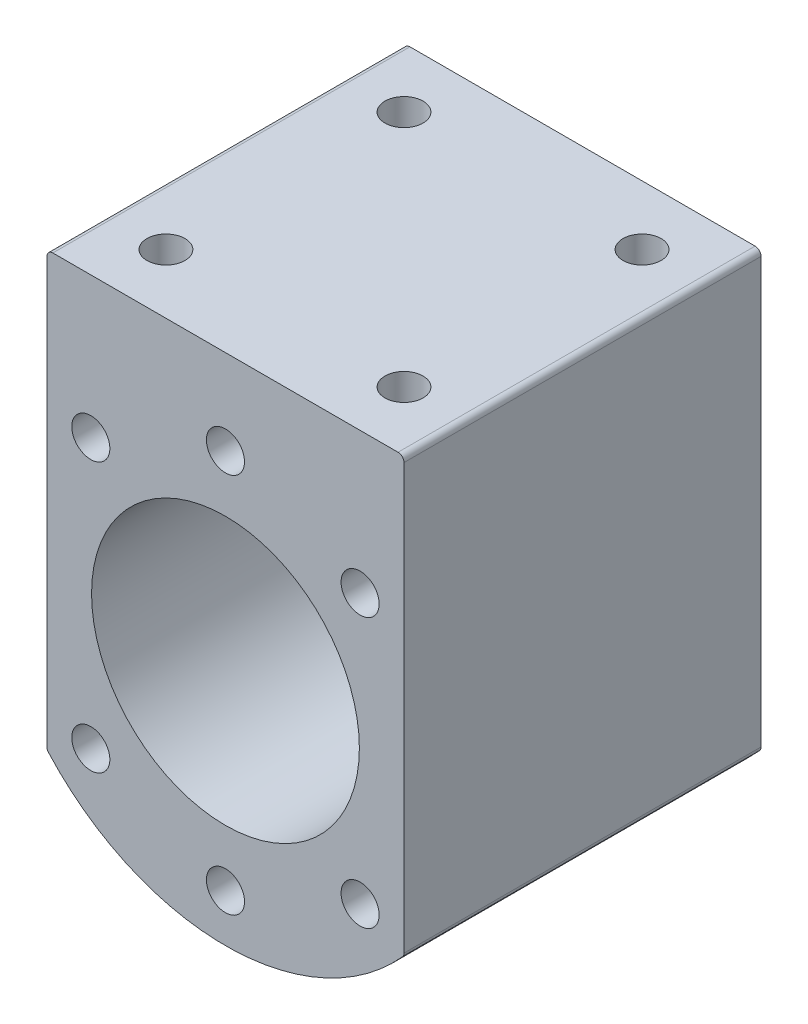
ISO-10303-21;
HEADER;
FILE_DESCRIPTION(('STEP AP214'),'2;1');
FILE_NAME('part.step','',(''),(''),'','','');
FILE_SCHEMA(('AUTOMOTIVE_DESIGN { 1 0 10303 214 1 1 1 1 }'));
ENDSEC;
DATA;
#1=APPLICATION_CONTEXT('core data for automotive mechanical design processes');
#2=APPLICATION_PROTOCOL_DEFINITION('international standard','automotive_design',2000,#1);
#3=PRODUCT_CONTEXT('',#1,'mechanical');
#4=PRODUCT('Part','Part','',(#3));
#5=PRODUCT_RELATED_PRODUCT_CATEGORY('part','',(#4));
#6=PRODUCT_DEFINITION_FORMATION('','',#4);
#7=PRODUCT_DEFINITION_CONTEXT('part definition',#1,'design');
#8=PRODUCT_DEFINITION('design','',#6,#7);
#9=PRODUCT_DEFINITION_SHAPE('','',#8);
#10=(LENGTH_UNIT() NAMED_UNIT(*) SI_UNIT(.MILLI.,.METRE.));
#11=(NAMED_UNIT(*) PLANE_ANGLE_UNIT() SI_UNIT($,.RADIAN.));
#12=(NAMED_UNIT(*) SI_UNIT($,.STERADIAN.) SOLID_ANGLE_UNIT());
#13=UNCERTAINTY_MEASURE_WITH_UNIT(LENGTH_MEASURE(1.E-05),#10,'distance_accuracy_value','');
#14=(GEOMETRIC_REPRESENTATION_CONTEXT(3) GLOBAL_UNCERTAINTY_ASSIGNED_CONTEXT((#13)) GLOBAL_UNIT_ASSIGNED_CONTEXT((#10,
#11,#12)) REPRESENTATION_CONTEXT('',''));
#15=CARTESIAN_POINT('',(0.,0.,0.));
#16=DIRECTION('',(0.,0.,1.));
#17=DIRECTION('',(1.,0.,0.));
#18=AXIS2_PLACEMENT_3D('',#15,#16,#17);
#19=CARTESIAN_POINT('',(15.,23.1512434446771,30.));
#20=DIRECTION('',(0.,-1.,0.));
#21=DIRECTION('',(0.,0.,-1.));
#22=AXIS2_PLACEMENT_3D('',#19,#20,#21);
#23=PLANE('',#22);
#24=CARTESIAN_POINT('',(10.,23.1512434446771,25.));
#25=DIRECTION('',(0.,1.,0.));
#26=DIRECTION('',(0.,0.,-1.));
#27=AXIS2_PLACEMENT_3D('',#24,#25,#26);
#28=CIRCLE('',#27,1.6);
#29=CARTESIAN_POINT('',(10.,23.1512434446771,23.4));
#30=VERTEX_POINT('',#29);
#31=EDGE_CURVE('E229',#30,#30,#28,.T.);
#32=ORIENTED_EDGE('',*,*,#31,.F.);
#33=EDGE_LOOP('',(#32));
#34=FACE_BOUND('',#33,.T.);
#35=CARTESIAN_POINT('',(9.99999999999999,23.1512434446771,5.));
#36=DIRECTION('',(0.,1.,0.));
#37=DIRECTION('',(0.,0.,1.));
#38=AXIS2_PLACEMENT_3D('',#35,#36,#37);
#39=CIRCLE('',#38,1.6);
#40=CARTESIAN_POINT('',(9.99999999999999,23.1512434446771,6.6));
#41=VERTEX_POINT('',#40);
#42=EDGE_CURVE('E223',#41,#41,#39,.T.);
#43=ORIENTED_EDGE('',*,*,#42,.F.);
#44=EDGE_LOOP('',(#43));
#45=FACE_BOUND('',#44,.T.);
#46=CARTESIAN_POINT('',(-10.,23.1512434446771,5.));
#47=DIRECTION('',(0.,1.,0.));
#48=DIRECTION('',(0.,0.,-1.));
#49=AXIS2_PLACEMENT_3D('',#46,#47,#48);
#50=CIRCLE('',#49,1.6);
#51=CARTESIAN_POINT('',(-10.,23.1512434446771,3.4));
#52=VERTEX_POINT('',#51);
#53=EDGE_CURVE('E217',#52,#52,#50,.T.);
#54=ORIENTED_EDGE('',*,*,#53,.F.);
#55=EDGE_LOOP('',(#54));
#56=FACE_BOUND('',#55,.T.);
#57=CARTESIAN_POINT('',(-10.,23.1512434446771,25.));
#58=DIRECTION('',(0.,1.,0.));
#59=DIRECTION('',(0.,0.,1.));
#60=AXIS2_PLACEMENT_3D('',#57,#58,#59);
#61=CIRCLE('',#60,1.6);
#62=CARTESIAN_POINT('',(-10.,23.1512434446771,26.6));
#63=VERTEX_POINT('',#62);
#64=EDGE_CURVE('E211',#63,#63,#61,.T.);
#65=ORIENTED_EDGE('',*,*,#64,.F.);
#66=EDGE_LOOP('',(#65));
#67=FACE_BOUND('',#66,.T.);
#68=DIRECTION('',(-1.,0.,0.));
#69=VECTOR('',#68,1.);
#70=CARTESIAN_POINT('',(15.,23.1512434446771,0.));
#71=LINE('',#70,#69);
#72=CARTESIAN_POINT('',(14.5,23.1512434446771,0.));
#73=VERTEX_POINT('',#72);
#74=CARTESIAN_POINT('',(-14.5,23.1512434446771,0.));
#75=VERTEX_POINT('',#74);
#76=EDGE_CURVE('E128',#73,#75,#71,.T.);
#77=ORIENTED_EDGE('',*,*,#76,.T.);
#78=DIRECTION('',(0.,0.,-1.));
#79=VECTOR('',#78,1.);
#80=CARTESIAN_POINT('',(-14.5,23.1512434446771,30.));
#81=LINE('',#80,#79);
#82=CARTESIAN_POINT('',(-14.5,23.1512434446771,30.));
#83=VERTEX_POINT('',#82);
#84=EDGE_CURVE('E11',#75,#83,#81,.F.);
#85=ORIENTED_EDGE('',*,*,#84,.T.);
#86=DIRECTION('',(-1.,0.,0.));
#87=VECTOR('',#86,1.);
#88=CARTESIAN_POINT('',(15.,23.1512434446771,30.));
#89=LINE('',#88,#87);
#90=CARTESIAN_POINT('',(14.5,23.1512434446771,30.));
#91=VERTEX_POINT('',#90);
#92=EDGE_CURVE('E126',#91,#83,#89,.T.);
#93=ORIENTED_EDGE('',*,*,#92,.F.);
#94=DIRECTION('',(0.,0.,-1.));
#95=VECTOR('',#94,1.);
#96=CARTESIAN_POINT('',(14.5,23.1512434446771,30.));
#97=LINE('',#96,#95);
#98=EDGE_CURVE('E40',#91,#73,#97,.T.);
#99=ORIENTED_EDGE('',*,*,#98,.T.);
#100=EDGE_LOOP('',(#77,#85,#93,#99));
#101=FACE_BOUND('',#100,.T.);
#102=ADVANCED_FACE('F32',(#34,#45,#56,#67,#101),#23,.F.);
#103=CARTESIAN_POINT('',(-15.,23.1512434446771,30.));
#104=DIRECTION('',(1.,0.,0.));
#105=DIRECTION('',(0.,1.,0.));
#106=AXIS2_PLACEMENT_3D('',#103,#104,#105);
#107=PLANE('',#106);
#108=DIRECTION('',(0.,-1.,0.));
#109=VECTOR('',#108,1.);
#110=CARTESIAN_POINT('',(-15.,23.1512434446771,0.));
#111=LINE('',#110,#109);
#112=CARTESIAN_POINT('',(-15.,22.6512434446771,0.));
#113=VERTEX_POINT('',#112);
#114=CARTESIAN_POINT('',(-15.,-13.0384048104053,0.));
#115=VERTEX_POINT('',#114);
#116=EDGE_CURVE('E124',#113,#115,#111,.T.);
#117=ORIENTED_EDGE('',*,*,#116,.T.);
#118=DIRECTION('',(0.,0.,-1.));
#119=VECTOR('',#118,1.);
#120=CARTESIAN_POINT('',(-15.,-13.0384048104053,30.));
#121=LINE('',#120,#119);
#122=CARTESIAN_POINT('',(-15.,-13.0384048104053,30.));
#123=VERTEX_POINT('',#122);
#124=EDGE_CURVE('E103',#115,#123,#121,.F.);
#125=ORIENTED_EDGE('',*,*,#124,.T.);
#126=DIRECTION('',(0.,-1.,0.));
#127=VECTOR('',#126,1.);
#128=CARTESIAN_POINT('',(-15.,23.1512434446771,30.));
#129=LINE('',#128,#127);
#130=CARTESIAN_POINT('',(-15.,22.6512434446771,30.));
#131=VERTEX_POINT('',#130);
#132=EDGE_CURVE('E188',#131,#123,#129,.T.);
#133=ORIENTED_EDGE('',*,*,#132,.F.);
#134=DIRECTION('',(0.,0.,-1.));
#135=VECTOR('',#134,1.);
#136=CARTESIAN_POINT('',(-15.,22.6512434446771,30.));
#137=LINE('',#136,#135);
#138=EDGE_CURVE('E108',#131,#113,#137,.T.);
#139=ORIENTED_EDGE('',*,*,#138,.T.);
#140=EDGE_LOOP('',(#117,#125,#133,#139));
#141=FACE_BOUND('',#140,.T.);
#142=ADVANCED_FACE('F246',(#141),#107,.F.);
#143=CARTESIAN_POINT('',(0.,0.,30.));
#144=DIRECTION('',(0.,0.,-1.));
#145=DIRECTION('',(-1.,0.,0.));
#146=AXIS2_PLACEMENT_3D('',#143,#144,#145);
#147=CYLINDRICAL_SURFACE('',#146,20.);
#148=CARTESIAN_POINT('',(0.,0.,30.));
#149=DIRECTION('',(0.,0.,1.));
#150=DIRECTION('',(1.,0.,0.));
#151=AXIS2_PLACEMENT_3D('',#148,#149,#150);
#152=CIRCLE('',#151,20.);
#153=CARTESIAN_POINT('',(-14.8717948717949,-13.372722882467,30.));
#154=VERTEX_POINT('',#153);
#155=CARTESIAN_POINT('',(14.8717948717949,-13.372722882467,30.));
#156=VERTEX_POINT('',#155);
#157=EDGE_CURVE('E117',#154,#156,#152,.T.);
#158=ORIENTED_EDGE('',*,*,#157,.F.);
#159=DIRECTION('',(0.,0.,-1.));
#160=VECTOR('',#159,1.);
#161=CARTESIAN_POINT('',(-14.8717948717949,-13.372722882467,30.));
#162=LINE('',#161,#160);
#163=CARTESIAN_POINT('',(-14.8717948717949,-13.372722882467,0.));
#164=VERTEX_POINT('',#163);
#165=EDGE_CURVE('E102',#154,#164,#162,.T.);
#166=ORIENTED_EDGE('',*,*,#165,.T.);
#167=CARTESIAN_POINT('',(0.,0.,0.));
#168=DIRECTION('',(0.,0.,1.));
#169=DIRECTION('',(1.,0.,0.));
#170=AXIS2_PLACEMENT_3D('',#167,#168,#169);
#171=CIRCLE('',#170,20.);
#172=CARTESIAN_POINT('',(14.8717948717949,-13.372722882467,0.));
#173=VERTEX_POINT('',#172);
#174=EDGE_CURVE('E115',#164,#173,#171,.T.);
#175=ORIENTED_EDGE('',*,*,#174,.T.);
#176=DIRECTION('',(0.,0.,-1.));
#177=VECTOR('',#176,1.);
#178=CARTESIAN_POINT('',(14.8717948717949,-13.372722882467,30.));
#179=LINE('',#178,#177);
#180=EDGE_CURVE('E119',#173,#156,#179,.F.);
#181=ORIENTED_EDGE('',*,*,#180,.T.);
#182=EDGE_LOOP('',(#158,#166,#175,#181));
#183=FACE_BOUND('',#182,.T.);
#184=ADVANCED_FACE('F114',(#183),#147,.T.);
#185=CARTESIAN_POINT('',(15.,23.1512434446771,30.));
#186=DIRECTION('',(-1.,0.,0.));
#187=DIRECTION('',(0.,-1.,0.));
#188=AXIS2_PLACEMENT_3D('',#185,#186,#187);
#189=PLANE('',#188);
#190=DIRECTION('',(0.,1.,0.));
#191=VECTOR('',#190,1.);
#192=CARTESIAN_POINT('',(15.,23.1512434446771,30.));
#193=LINE('',#192,#191);
#194=CARTESIAN_POINT('',(15.,-13.0384048104053,30.));
#195=VERTEX_POINT('',#194);
#196=CARTESIAN_POINT('',(15.,22.6512434446771,30.));
#197=VERTEX_POINT('',#196);
#198=EDGE_CURVE('E156',#195,#197,#193,.T.);
#199=ORIENTED_EDGE('',*,*,#198,.F.);
#200=DIRECTION('',(0.,0.,-1.));
#201=VECTOR('',#200,1.);
#202=CARTESIAN_POINT('',(15.,-13.0384048104053,30.));
#203=LINE('',#202,#201);
#204=CARTESIAN_POINT('',(15.,-13.0384048104053,0.));
#205=VERTEX_POINT('',#204);
#206=EDGE_CURVE('E173',#195,#205,#203,.T.);
#207=ORIENTED_EDGE('',*,*,#206,.T.);
#208=DIRECTION('',(0.,1.,0.));
#209=VECTOR('',#208,1.);
#210=CARTESIAN_POINT('',(15.,23.1512434446771,0.));
#211=LINE('',#210,#209);
#212=CARTESIAN_POINT('',(15.,22.6512434446771,0.));
#213=VERTEX_POINT('',#212);
#214=EDGE_CURVE('E123',#205,#213,#211,.T.);
#215=ORIENTED_EDGE('',*,*,#214,.T.);
#216=DIRECTION('',(0.,0.,-1.));
#217=VECTOR('',#216,1.);
#218=CARTESIAN_POINT('',(15.,22.6512434446771,30.));
#219=LINE('',#218,#217);
#220=EDGE_CURVE('E47',#213,#197,#219,.F.);
#221=ORIENTED_EDGE('',*,*,#220,.T.);
#222=EDGE_LOOP('',(#199,#207,#215,#221));
#223=FACE_BOUND('',#222,.T.);
#224=ADVANCED_FACE('F323',(#223),#189,.F.);
#225=CARTESIAN_POINT('',(0.,0.,30.));
#226=DIRECTION('',(0.,0.,1.));
#227=DIRECTION('',(1.,0.,0.));
#228=AXIS2_PLACEMENT_3D('',#225,#226,#227);
#229=PLANE('',#228);
#230=CARTESIAN_POINT('',(0.,0.,30.));
#231=DIRECTION('',(0.,0.,-1.));
#232=DIRECTION('',(-1.,0.,0.));
#233=AXIS2_PLACEMENT_3D('',#230,#231,#232);
#234=CIRCLE('',#233,11.25);
#235=CARTESIAN_POINT('',(-11.25,0.,30.));
#236=VERTEX_POINT('',#235);
#237=EDGE_CURVE('E204',#236,#236,#234,.T.);
#238=ORIENTED_EDGE('',*,*,#237,.T.);
#239=EDGE_LOOP('',(#238));
#240=FACE_BOUND('',#239,.T.);
#241=CARTESIAN_POINT('',(-11.3137084989847,-11.3137084989848,30.));
#242=DIRECTION('',(0.,0.,1.));
#243=DIRECTION('',(1.,0.,0.));
#244=AXIS2_PLACEMENT_3D('',#241,#242,#243);
#245=CIRCLE('',#244,1.6);
#246=CARTESIAN_POINT('',(-9.7137084989847,-11.3137084989848,30.));
#247=VERTEX_POINT('',#246);
#248=EDGE_CURVE('E152',#247,#247,#245,.F.);
#249=ORIENTED_EDGE('',*,*,#248,.T.);
#250=EDGE_LOOP('',(#249));
#251=FACE_BOUND('',#250,.T.);
#252=CARTESIAN_POINT('',(0.,-16.,30.));
#253=DIRECTION('',(0.,0.,1.));
#254=DIRECTION('',(1.,0.,0.));
#255=AXIS2_PLACEMENT_3D('',#252,#253,#254);
#256=CIRCLE('',#255,1.6);
#257=CARTESIAN_POINT('',(1.6,-16.,30.));
#258=VERTEX_POINT('',#257);
#259=EDGE_CURVE('E148',#258,#258,#256,.F.);
#260=ORIENTED_EDGE('',*,*,#259,.T.);
#261=EDGE_LOOP('',(#260));
#262=FACE_BOUND('',#261,.T.);
#263=CARTESIAN_POINT('',(11.3137084989847,-11.3137084989848,30.));
#264=DIRECTION('',(0.,0.,1.));
#265=DIRECTION('',(1.,0.,0.));
#266=AXIS2_PLACEMENT_3D('',#263,#264,#265);
#267=CIRCLE('',#266,1.6);
#268=CARTESIAN_POINT('',(12.9137084989847,-11.3137084989848,30.));
#269=VERTEX_POINT('',#268);
#270=EDGE_CURVE('E144',#269,#269,#267,.F.);
#271=ORIENTED_EDGE('',*,*,#270,.T.);
#272=EDGE_LOOP('',(#271));
#273=FACE_BOUND('',#272,.T.);
#274=CARTESIAN_POINT('',(-11.3137084989847,11.3137084989848,30.));
#275=DIRECTION('',(0.,0.,1.));
#276=DIRECTION('',(1.,0.,0.));
#277=AXIS2_PLACEMENT_3D('',#274,#275,#276);
#278=CIRCLE('',#277,1.6);
#279=CARTESIAN_POINT('',(-9.7137084989847,11.3137084989848,30.));
#280=VERTEX_POINT('',#279);
#281=EDGE_CURVE('E140',#280,#280,#278,.T.);
#282=ORIENTED_EDGE('',*,*,#281,.F.);
#283=EDGE_LOOP('',(#282));
#284=FACE_BOUND('',#283,.T.);
#285=CARTESIAN_POINT('',(0.,16.,30.));
#286=DIRECTION('',(0.,0.,1.));
#287=DIRECTION('',(1.,0.,0.));
#288=AXIS2_PLACEMENT_3D('',#285,#286,#287);
#289=CIRCLE('',#288,1.6);
#290=CARTESIAN_POINT('',(1.6,16.,30.));
#291=VERTEX_POINT('',#290);
#292=EDGE_CURVE('E136',#291,#291,#289,.T.);
#293=ORIENTED_EDGE('',*,*,#292,.F.);
#294=EDGE_LOOP('',(#293));
#295=FACE_BOUND('',#294,.T.);
#296=CARTESIAN_POINT('',(11.3137084989847,11.3137084989848,30.));
#297=DIRECTION('',(0.,0.,1.));
#298=DIRECTION('',(1.,0.,0.));
#299=AXIS2_PLACEMENT_3D('',#296,#297,#298);
#300=CIRCLE('',#299,1.6);
#301=CARTESIAN_POINT('',(12.9137084989847,11.3137084989848,30.));
#302=VERTEX_POINT('',#301);
#303=EDGE_CURVE('E132',#302,#302,#300,.T.);
#304=ORIENTED_EDGE('',*,*,#303,.F.);
#305=EDGE_LOOP('',(#304));
#306=FACE_BOUND('',#305,.T.);
#307=ORIENTED_EDGE('',*,*,#132,.T.);
#308=CARTESIAN_POINT('',(-14.5,-13.0384048104053,30.));
#309=DIRECTION('',(0.,0.,1.));
#310=DIRECTION('',(1.,0.,0.));
#311=AXIS2_PLACEMENT_3D('',#308,#309,#310);
#312=CIRCLE('',#311,0.5);
#313=EDGE_CURVE('E170',#123,#154,#312,.T.);
#314=ORIENTED_EDGE('',*,*,#313,.T.);
#315=ORIENTED_EDGE('',*,*,#157,.T.);
#316=CARTESIAN_POINT('',(14.5,-13.0384048104053,30.));
#317=DIRECTION('',(0.,0.,1.));
#318=DIRECTION('',(1.,0.,0.));
#319=AXIS2_PLACEMENT_3D('',#316,#317,#318);
#320=CIRCLE('',#319,0.5);
#321=EDGE_CURVE('E54',#156,#195,#320,.T.);
#322=ORIENTED_EDGE('',*,*,#321,.T.);
#323=ORIENTED_EDGE('',*,*,#198,.T.);
#324=CARTESIAN_POINT('',(14.5,22.6512434446771,30.));
#325=DIRECTION('',(0.,0.,1.));
#326=DIRECTION('',(1.,0.,0.));
#327=AXIS2_PLACEMENT_3D('',#324,#325,#326);
#328=CIRCLE('',#327,0.5);
#329=EDGE_CURVE('E165',#197,#91,#328,.T.);
#330=ORIENTED_EDGE('',*,*,#329,.T.);
#331=ORIENTED_EDGE('',*,*,#92,.T.);
#332=CARTESIAN_POINT('',(-14.5,22.6512434446771,30.));
#333=DIRECTION('',(0.,0.,1.));
#334=DIRECTION('',(1.,0.,0.));
#335=AXIS2_PLACEMENT_3D('',#332,#333,#334);
#336=CIRCLE('',#335,0.5);
#337=EDGE_CURVE('E167',#83,#131,#336,.T.);
#338=ORIENTED_EDGE('',*,*,#337,.T.);
#339=EDGE_LOOP('',(#307,#314,#315,#322,#323,#330,#331,#338));
#340=FACE_BOUND('',#339,.T.);
#341=ADVANCED_FACE('F320',(#240,#251,#262,#273,#284,#295,#306,#340),#229,.T.);
#342=CARTESIAN_POINT('',(0.,0.,0.));
#343=DIRECTION('',(0.,0.,1.));
#344=DIRECTION('',(1.,0.,0.));
#345=AXIS2_PLACEMENT_3D('',#342,#343,#344);
#346=PLANE('',#345);
#347=CARTESIAN_POINT('',(0.,0.,0.));
#348=DIRECTION('',(0.,0.,-1.));
#349=DIRECTION('',(-1.,0.,0.));
#350=AXIS2_PLACEMENT_3D('',#347,#348,#349);
#351=CIRCLE('',#350,11.25);
#352=CARTESIAN_POINT('',(-11.25,0.,0.));
#353=VERTEX_POINT('',#352);
#354=EDGE_CURVE('E205',#353,#353,#351,.T.);
#355=ORIENTED_EDGE('',*,*,#354,.F.);
#356=EDGE_LOOP('',(#355));
#357=FACE_BOUND('',#356,.T.);
#358=ORIENTED_EDGE('',*,*,#174,.F.);
#359=CARTESIAN_POINT('',(-14.5,-13.0384048104053,0.));
#360=DIRECTION('',(0.,0.,1.));
#361=DIRECTION('',(1.,0.,0.));
#362=AXIS2_PLACEMENT_3D('',#359,#360,#361);
#363=CIRCLE('',#362,0.5);
#364=EDGE_CURVE('E98',#164,#115,#363,.F.);
#365=ORIENTED_EDGE('',*,*,#364,.T.);
#366=ORIENTED_EDGE('',*,*,#116,.F.);
#367=CARTESIAN_POINT('',(-14.5,22.6512434446771,0.));
#368=DIRECTION('',(0.,0.,1.));
#369=DIRECTION('',(1.,0.,0.));
#370=AXIS2_PLACEMENT_3D('',#367,#368,#369);
#371=CIRCLE('',#370,0.5);
#372=EDGE_CURVE('E159',#113,#75,#371,.F.);
#373=ORIENTED_EDGE('',*,*,#372,.T.);
#374=ORIENTED_EDGE('',*,*,#76,.F.);
#375=CARTESIAN_POINT('',(14.5,22.6512434446771,0.));
#376=DIRECTION('',(0.,0.,1.));
#377=DIRECTION('',(1.,0.,0.));
#378=AXIS2_PLACEMENT_3D('',#375,#376,#377);
#379=CIRCLE('',#378,0.5);
#380=EDGE_CURVE('E118',#73,#213,#379,.F.);
#381=ORIENTED_EDGE('',*,*,#380,.T.);
#382=ORIENTED_EDGE('',*,*,#214,.F.);
#383=CARTESIAN_POINT('',(14.5,-13.0384048104053,0.));
#384=DIRECTION('',(0.,0.,1.));
#385=DIRECTION('',(1.,0.,0.));
#386=AXIS2_PLACEMENT_3D('',#383,#384,#385);
#387=CIRCLE('',#386,0.5);
#388=EDGE_CURVE('E109',#205,#173,#387,.F.);
#389=ORIENTED_EDGE('',*,*,#388,.T.);
#390=EDGE_LOOP('',(#358,#365,#366,#373,#374,#381,#382,#389));
#391=FACE_BOUND('',#390,.T.);
#392=ADVANCED_FACE('F121',(#357,#391),#346,.F.);
#393=CARTESIAN_POINT('',(11.3137084989847,11.3137084989848,40.));
#394=DIRECTION('',(0.,0.,-1.));
#395=DIRECTION('',(-1.,0.,0.));
#396=AXIS2_PLACEMENT_3D('',#393,#394,#395);
#397=CYLINDRICAL_SURFACE('',#396,1.6);
#398=ORIENTED_EDGE('',*,*,#303,.T.);
#399=EDGE_LOOP('',(#398));
#400=FACE_BOUND('',#399,.T.);
#401=CARTESIAN_POINT('',(11.3137084989847,11.3137084989848,20.));
#402=DIRECTION('',(0.,0.,-1.));
#403=DIRECTION('',(-1.,0.,0.));
#404=AXIS2_PLACEMENT_3D('',#401,#402,#403);
#405=CIRCLE('',#404,1.6);
#406=CARTESIAN_POINT('',(9.7137084989847,11.3137084989848,20.));
#407=VERTEX_POINT('',#406);
#408=EDGE_CURVE('E135',#407,#407,#405,.T.);
#409=ORIENTED_EDGE('',*,*,#408,.T.);
#410=EDGE_LOOP('',(#409));
#411=FACE_BOUND('',#410,.T.);
#412=ADVANCED_FACE('F315',(#400,#411),#397,.F.);
#413=CARTESIAN_POINT('',(11.3137084989847,11.3137084989848,20.));
#414=DIRECTION('',(0.,0.,-1.));
#415=DIRECTION('',(-1.,0.,0.));
#416=AXIS2_PLACEMENT_3D('',#413,#414,#415);
#417=PLANE('',#416);
#418=ORIENTED_EDGE('',*,*,#408,.F.);
#419=EDGE_LOOP('',(#418));
#420=FACE_BOUND('',#419,.T.);
#421=ADVANCED_FACE('F311',(#420),#417,.F.);
#422=CARTESIAN_POINT('',(0.,16.,40.));
#423=DIRECTION('',(0.,0.,-1.));
#424=DIRECTION('',(-1.,0.,0.));
#425=AXIS2_PLACEMENT_3D('',#422,#423,#424);
#426=CYLINDRICAL_SURFACE('',#425,1.6);
#427=ORIENTED_EDGE('',*,*,#292,.T.);
#428=EDGE_LOOP('',(#427));
#429=FACE_BOUND('',#428,.T.);
#430=CARTESIAN_POINT('',(0.,16.,20.));
#431=DIRECTION('',(0.,0.,-1.));
#432=DIRECTION('',(-1.,0.,0.));
#433=AXIS2_PLACEMENT_3D('',#430,#431,#432);
#434=CIRCLE('',#433,1.6);
#435=CARTESIAN_POINT('',(-1.6,16.,20.));
#436=VERTEX_POINT('',#435);
#437=EDGE_CURVE('E139',#436,#436,#434,.T.);
#438=ORIENTED_EDGE('',*,*,#437,.T.);
#439=EDGE_LOOP('',(#438));
#440=FACE_BOUND('',#439,.T.);
#441=ADVANCED_FACE('F307',(#429,#440),#426,.F.);
#442=CARTESIAN_POINT('',(0.,16.,20.));
#443=DIRECTION('',(0.,0.,-1.));
#444=DIRECTION('',(-1.,0.,0.));
#445=AXIS2_PLACEMENT_3D('',#442,#443,#444);
#446=PLANE('',#445);
#447=ORIENTED_EDGE('',*,*,#437,.F.);
#448=EDGE_LOOP('',(#447));
#449=FACE_BOUND('',#448,.T.);
#450=ADVANCED_FACE('F303',(#449),#446,.F.);
#451=CARTESIAN_POINT('',(-11.3137084989847,11.3137084989848,40.));
#452=DIRECTION('',(0.,0.,-1.));
#453=DIRECTION('',(-1.,0.,0.));
#454=AXIS2_PLACEMENT_3D('',#451,#452,#453);
#455=CYLINDRICAL_SURFACE('',#454,1.6);
#456=ORIENTED_EDGE('',*,*,#281,.T.);
#457=EDGE_LOOP('',(#456));
#458=FACE_BOUND('',#457,.T.);
#459=CARTESIAN_POINT('',(-11.3137084989847,11.3137084989848,20.));
#460=DIRECTION('',(0.,0.,-1.));
#461=DIRECTION('',(-1.,0.,0.));
#462=AXIS2_PLACEMENT_3D('',#459,#460,#461);
#463=CIRCLE('',#462,1.6);
#464=CARTESIAN_POINT('',(-12.9137084989847,11.3137084989848,20.));
#465=VERTEX_POINT('',#464);
#466=EDGE_CURVE('E143',#465,#465,#463,.T.);
#467=ORIENTED_EDGE('',*,*,#466,.T.);
#468=EDGE_LOOP('',(#467));
#469=FACE_BOUND('',#468,.T.);
#470=ADVANCED_FACE('F299',(#458,#469),#455,.F.);
#471=CARTESIAN_POINT('',(-11.3137084989847,11.3137084989848,20.));
#472=DIRECTION('',(0.,0.,-1.));
#473=DIRECTION('',(-1.,0.,0.));
#474=AXIS2_PLACEMENT_3D('',#471,#472,#473);
#475=PLANE('',#474);
#476=ORIENTED_EDGE('',*,*,#466,.F.);
#477=EDGE_LOOP('',(#476));
#478=FACE_BOUND('',#477,.T.);
#479=ADVANCED_FACE('F295',(#478),#475,.F.);
#480=CARTESIAN_POINT('',(11.3137084989847,-11.3137084989848,40.));
#481=DIRECTION('',(0.,0.,-1.));
#482=DIRECTION('',(-1.,0.,0.));
#483=AXIS2_PLACEMENT_3D('',#480,#481,#482);
#484=CYLINDRICAL_SURFACE('',#483,1.6);
#485=ORIENTED_EDGE('',*,*,#270,.F.);
#486=EDGE_LOOP('',(#485));
#487=FACE_BOUND('',#486,.T.);
#488=CARTESIAN_POINT('',(11.3137084989847,-11.3137084989848,20.));
#489=DIRECTION('',(0.,0.,1.));
#490=DIRECTION('',(-1.,0.,0.));
#491=AXIS2_PLACEMENT_3D('',#488,#489,#490);
#492=CIRCLE('',#491,1.6);
#493=CARTESIAN_POINT('',(9.7137084989847,-11.3137084989848,20.));
#494=VERTEX_POINT('',#493);
#495=EDGE_CURVE('E147',#494,#494,#492,.T.);
#496=ORIENTED_EDGE('',*,*,#495,.F.);
#497=EDGE_LOOP('',(#496));
#498=FACE_BOUND('',#497,.T.);
#499=ADVANCED_FACE('F291',(#487,#498),#484,.F.);
#500=CARTESIAN_POINT('',(11.3137084989847,-11.3137084989848,20.));
#501=DIRECTION('',(0.,0.,-1.));
#502=DIRECTION('',(-1.,0.,0.));
#503=AXIS2_PLACEMENT_3D('',#500,#501,#502);
#504=PLANE('',#503);
#505=ORIENTED_EDGE('',*,*,#495,.T.);
#506=EDGE_LOOP('',(#505));
#507=FACE_BOUND('',#506,.T.);
#508=ADVANCED_FACE('F287',(#507),#504,.F.);
#509=CARTESIAN_POINT('',(0.,-16.,40.));
#510=DIRECTION('',(0.,0.,-1.));
#511=DIRECTION('',(-1.,0.,0.));
#512=AXIS2_PLACEMENT_3D('',#509,#510,#511);
#513=CYLINDRICAL_SURFACE('',#512,1.6);
#514=ORIENTED_EDGE('',*,*,#259,.F.);
#515=EDGE_LOOP('',(#514));
#516=FACE_BOUND('',#515,.T.);
#517=CARTESIAN_POINT('',(0.,-16.,20.));
#518=DIRECTION('',(0.,0.,1.));
#519=DIRECTION('',(-1.,0.,0.));
#520=AXIS2_PLACEMENT_3D('',#517,#518,#519);
#521=CIRCLE('',#520,1.6);
#522=CARTESIAN_POINT('',(-1.6,-16.,20.));
#523=VERTEX_POINT('',#522);
#524=EDGE_CURVE('E151',#523,#523,#521,.T.);
#525=ORIENTED_EDGE('',*,*,#524,.F.);
#526=EDGE_LOOP('',(#525));
#527=FACE_BOUND('',#526,.T.);
#528=ADVANCED_FACE('F283',(#516,#527),#513,.F.);
#529=CARTESIAN_POINT('',(0.,-16.,20.));
#530=DIRECTION('',(0.,0.,-1.));
#531=DIRECTION('',(-1.,0.,0.));
#532=AXIS2_PLACEMENT_3D('',#529,#530,#531);
#533=PLANE('',#532);
#534=ORIENTED_EDGE('',*,*,#524,.T.);
#535=EDGE_LOOP('',(#534));
#536=FACE_BOUND('',#535,.T.);
#537=ADVANCED_FACE('F279',(#536),#533,.F.);
#538=CARTESIAN_POINT('',(-11.3137084989847,-11.3137084989848,40.));
#539=DIRECTION('',(0.,0.,-1.));
#540=DIRECTION('',(-1.,0.,0.));
#541=AXIS2_PLACEMENT_3D('',#538,#539,#540);
#542=CYLINDRICAL_SURFACE('',#541,1.6);
#543=ORIENTED_EDGE('',*,*,#248,.F.);
#544=EDGE_LOOP('',(#543));
#545=FACE_BOUND('',#544,.T.);
#546=CARTESIAN_POINT('',(-11.3137084989847,-11.3137084989848,20.));
#547=DIRECTION('',(0.,0.,1.));
#548=DIRECTION('',(-1.,0.,0.));
#549=AXIS2_PLACEMENT_3D('',#546,#547,#548);
#550=CIRCLE('',#549,1.6);
#551=CARTESIAN_POINT('',(-12.9137084989847,-11.3137084989848,20.));
#552=VERTEX_POINT('',#551);
#553=EDGE_CURVE('E155',#552,#552,#550,.T.);
#554=ORIENTED_EDGE('',*,*,#553,.F.);
#555=EDGE_LOOP('',(#554));
#556=FACE_BOUND('',#555,.T.);
#557=ADVANCED_FACE('F275',(#545,#556),#542,.F.);
#558=CARTESIAN_POINT('',(-11.3137084989847,-11.3137084989848,20.));
#559=DIRECTION('',(0.,0.,-1.));
#560=DIRECTION('',(-1.,0.,0.));
#561=AXIS2_PLACEMENT_3D('',#558,#559,#560);
#562=PLANE('',#561);
#563=ORIENTED_EDGE('',*,*,#553,.T.);
#564=EDGE_LOOP('',(#563));
#565=FACE_BOUND('',#564,.T.);
#566=ADVANCED_FACE('F267',(#565),#562,.F.);
#567=CARTESIAN_POINT('',(0.,0.,30.));
#568=DIRECTION('',(0.,0.,-1.));
#569=DIRECTION('',(-1.,0.,0.));
#570=AXIS2_PLACEMENT_3D('',#567,#568,#569);
#571=CYLINDRICAL_SURFACE('',#570,11.25);
#572=ORIENTED_EDGE('',*,*,#237,.F.);
#573=EDGE_LOOP('',(#572));
#574=FACE_BOUND('',#573,.T.);
#575=ORIENTED_EDGE('',*,*,#354,.T.);
#576=EDGE_LOOP('',(#575));
#577=FACE_BOUND('',#576,.T.);
#578=ADVANCED_FACE('F257',(#574,#577),#571,.F.);
#579=CARTESIAN_POINT('',(-10.,14.1512434446771,25.));
#580=DIRECTION('',(0.,1.,0.));
#581=DIRECTION('',(0.,0.,1.));
#582=AXIS2_PLACEMENT_3D('',#579,#580,#581);
#583=CYLINDRICAL_SURFACE('',#582,1.6);
#584=CARTESIAN_POINT('',(-10.,14.1512434446771,25.));
#585=DIRECTION('',(0.,1.,0.));
#586=DIRECTION('',(0.,0.,1.));
#587=AXIS2_PLACEMENT_3D('',#584,#585,#586);
#588=CIRCLE('',#587,1.6);
#589=CARTESIAN_POINT('',(-10.,14.1512434446771,26.6));
#590=VERTEX_POINT('',#589);
#591=EDGE_CURVE('E208',#590,#590,#588,.T.);
#592=ORIENTED_EDGE('',*,*,#591,.F.);
#593=EDGE_LOOP('',(#592));
#594=FACE_BOUND('',#593,.T.);
#595=ORIENTED_EDGE('',*,*,#64,.T.);
#596=EDGE_LOOP('',(#595));
#597=FACE_BOUND('',#596,.T.);
#598=ADVANCED_FACE('F254',(#594,#597),#583,.F.);
#599=CARTESIAN_POINT('',(-10.,14.1512434446771,25.));
#600=DIRECTION('',(0.,1.,0.));
#601=DIRECTION('',(0.,0.,1.));
#602=AXIS2_PLACEMENT_3D('',#599,#600,#601);
#603=PLANE('',#602);
#604=ORIENTED_EDGE('',*,*,#591,.T.);
#605=EDGE_LOOP('',(#604));
#606=FACE_BOUND('',#605,.T.);
#607=ADVANCED_FACE('F256',(#606),#603,.T.);
#608=CARTESIAN_POINT('',(-10.,14.1512434446771,5.));
#609=DIRECTION('',(0.,1.,0.));
#610=DIRECTION('',(0.,0.,1.));
#611=AXIS2_PLACEMENT_3D('',#608,#609,#610);
#612=CYLINDRICAL_SURFACE('',#611,1.6);
#613=CARTESIAN_POINT('',(-10.,14.1512434446771,5.));
#614=DIRECTION('',(0.,1.,0.));
#615=DIRECTION('',(0.,0.,-1.));
#616=AXIS2_PLACEMENT_3D('',#613,#614,#615);
#617=CIRCLE('',#616,1.6);
#618=CARTESIAN_POINT('',(-10.,14.1512434446771,3.4));
#619=VERTEX_POINT('',#618);
#620=EDGE_CURVE('E220',#619,#619,#617,.T.);
#621=ORIENTED_EDGE('',*,*,#620,.F.);
#622=EDGE_LOOP('',(#621));
#623=FACE_BOUND('',#622,.T.);
#624=ORIENTED_EDGE('',*,*,#53,.T.);
#625=EDGE_LOOP('',(#624));
#626=FACE_BOUND('',#625,.T.);
#627=ADVANCED_FACE('F264',(#623,#626),#612,.F.);
#628=CARTESIAN_POINT('',(-10.,14.1512434446771,5.));
#629=DIRECTION('',(0.,-1.,0.));
#630=DIRECTION('',(0.,0.,-1.));
#631=AXIS2_PLACEMENT_3D('',#628,#629,#630);
#632=PLANE('',#631);
#633=ORIENTED_EDGE('',*,*,#620,.T.);
#634=EDGE_LOOP('',(#633));
#635=FACE_BOUND('',#634,.T.);
#636=ADVANCED_FACE('F438',(#635),#632,.F.);
#637=CARTESIAN_POINT('',(9.99999999999999,14.1512434446771,5.));
#638=DIRECTION('',(0.,1.,0.));
#639=DIRECTION('',(0.,0.,1.));
#640=AXIS2_PLACEMENT_3D('',#637,#638,#639);
#641=CYLINDRICAL_SURFACE('',#640,1.6);
#642=CARTESIAN_POINT('',(9.99999999999999,14.1512434446771,5.));
#643=DIRECTION('',(0.,1.,0.));
#644=DIRECTION('',(0.,0.,1.));
#645=AXIS2_PLACEMENT_3D('',#642,#643,#644);
#646=CIRCLE('',#645,1.6);
#647=CARTESIAN_POINT('',(9.99999999999999,14.1512434446771,6.6));
#648=VERTEX_POINT('',#647);
#649=EDGE_CURVE('E226',#648,#648,#646,.T.);
#650=ORIENTED_EDGE('',*,*,#649,.F.);
#651=EDGE_LOOP('',(#650));
#652=FACE_BOUND('',#651,.T.);
#653=ORIENTED_EDGE('',*,*,#42,.T.);
#654=EDGE_LOOP('',(#653));
#655=FACE_BOUND('',#654,.T.);
#656=ADVANCED_FACE('F428',(#652,#655),#641,.F.);
#657=CARTESIAN_POINT('',(9.99999999999999,14.1512434446771,5.));
#658=DIRECTION('',(0.,1.,0.));
#659=DIRECTION('',(0.,0.,1.));
#660=AXIS2_PLACEMENT_3D('',#657,#658,#659);
#661=PLANE('',#660);
#662=ORIENTED_EDGE('',*,*,#649,.T.);
#663=EDGE_LOOP('',(#662));
#664=FACE_BOUND('',#663,.T.);
#665=ADVANCED_FACE('F240',(#664),#661,.T.);
#666=CARTESIAN_POINT('',(10.,14.1512434446771,25.));
#667=DIRECTION('',(0.,1.,0.));
#668=DIRECTION('',(0.,0.,1.));
#669=AXIS2_PLACEMENT_3D('',#666,#667,#668);
#670=CYLINDRICAL_SURFACE('',#669,1.6);
#671=CARTESIAN_POINT('',(10.,14.1512434446771,25.));
#672=DIRECTION('',(0.,1.,0.));
#673=DIRECTION('',(0.,0.,-1.));
#674=AXIS2_PLACEMENT_3D('',#671,#672,#673);
#675=CIRCLE('',#674,1.6);
#676=CARTESIAN_POINT('',(10.,14.1512434446771,23.4));
#677=VERTEX_POINT('',#676);
#678=EDGE_CURVE('E214',#677,#677,#675,.T.);
#679=ORIENTED_EDGE('',*,*,#678,.F.);
#680=EDGE_LOOP('',(#679));
#681=FACE_BOUND('',#680,.T.);
#682=ORIENTED_EDGE('',*,*,#31,.T.);
#683=EDGE_LOOP('',(#682));
#684=FACE_BOUND('',#683,.T.);
#685=ADVANCED_FACE('F237',(#681,#684),#670,.F.);
#686=CARTESIAN_POINT('',(10.,14.1512434446771,25.));
#687=DIRECTION('',(0.,-1.,0.));
#688=DIRECTION('',(0.,0.,-1.));
#689=AXIS2_PLACEMENT_3D('',#686,#687,#688);
#690=PLANE('',#689);
#691=ORIENTED_EDGE('',*,*,#678,.T.);
#692=EDGE_LOOP('',(#691));
#693=FACE_BOUND('',#692,.T.);
#694=ADVANCED_FACE('F235',(#693),#690,.F.);
#695=CARTESIAN_POINT('',(-14.5,-13.0384048104053,30.));
#696=DIRECTION('',(0.,0.,-1.));
#697=DIRECTION('',(-1.,0.,0.));
#698=AXIS2_PLACEMENT_3D('',#695,#696,#697);
#699=CYLINDRICAL_SURFACE('',#698,0.5);
#700=ORIENTED_EDGE('',*,*,#313,.F.);
#701=ORIENTED_EDGE('',*,*,#124,.F.);
#702=ORIENTED_EDGE('',*,*,#364,.F.);
#703=ORIENTED_EDGE('',*,*,#165,.F.);
#704=EDGE_LOOP('',(#700,#701,#702,#703));
#705=FACE_BOUND('',#704,.T.);
#706=ADVANCED_FACE('F101',(#705),#699,.T.);
#707=CARTESIAN_POINT('',(14.5,-13.0384048104053,30.));
#708=DIRECTION('',(0.,0.,-1.));
#709=DIRECTION('',(-1.,0.,0.));
#710=AXIS2_PLACEMENT_3D('',#707,#708,#709);
#711=CYLINDRICAL_SURFACE('',#710,0.5);
#712=ORIENTED_EDGE('',*,*,#321,.F.);
#713=ORIENTED_EDGE('',*,*,#180,.F.);
#714=ORIENTED_EDGE('',*,*,#388,.F.);
#715=ORIENTED_EDGE('',*,*,#206,.F.);
#716=EDGE_LOOP('',(#712,#713,#714,#715));
#717=FACE_BOUND('',#716,.T.);
#718=ADVANCED_FACE('F337',(#717),#711,.T.);
#719=CARTESIAN_POINT('',(-14.5,22.6512434446771,30.));
#720=DIRECTION('',(0.,0.,-1.));
#721=DIRECTION('',(-1.,0.,0.));
#722=AXIS2_PLACEMENT_3D('',#719,#720,#721);
#723=CYLINDRICAL_SURFACE('',#722,0.5);
#724=ORIENTED_EDGE('',*,*,#337,.F.);
#725=ORIENTED_EDGE('',*,*,#84,.F.);
#726=ORIENTED_EDGE('',*,*,#372,.F.);
#727=ORIENTED_EDGE('',*,*,#138,.F.);
#728=EDGE_LOOP('',(#724,#725,#726,#727));
#729=FACE_BOUND('',#728,.T.);
#730=ADVANCED_FACE('F339',(#729),#723,.T.);
#731=CARTESIAN_POINT('',(14.5,22.6512434446771,30.));
#732=DIRECTION('',(0.,0.,-1.));
#733=DIRECTION('',(-1.,0.,0.));
#734=AXIS2_PLACEMENT_3D('',#731,#732,#733);
#735=CYLINDRICAL_SURFACE('',#734,0.5);
#736=ORIENTED_EDGE('',*,*,#329,.F.);
#737=ORIENTED_EDGE('',*,*,#220,.F.);
#738=ORIENTED_EDGE('',*,*,#380,.F.);
#739=ORIENTED_EDGE('',*,*,#98,.F.);
#740=EDGE_LOOP('',(#736,#737,#738,#739));
#741=FACE_BOUND('',#740,.T.);
#742=ADVANCED_FACE('F34',(#741),#735,.T.);
#743=CLOSED_SHELL('',(#102,#142,#184,#224,#341,#392,#412,#421,#441,#450,#470,#479,#499,#508,
#528,#537,#557,#566,#578,#598,#607,#627,#636,#656,#665,#685,#694,#706,#718,#730,#742));
#744=MANIFOLD_SOLID_BREP('B2',#743);
#745=ADVANCED_BREP_SHAPE_REPRESENTATION('',(#18,#744),#14);
#746=SHAPE_DEFINITION_REPRESENTATION(#9,#745);
ENDSEC;
END-ISO-10303-21;
